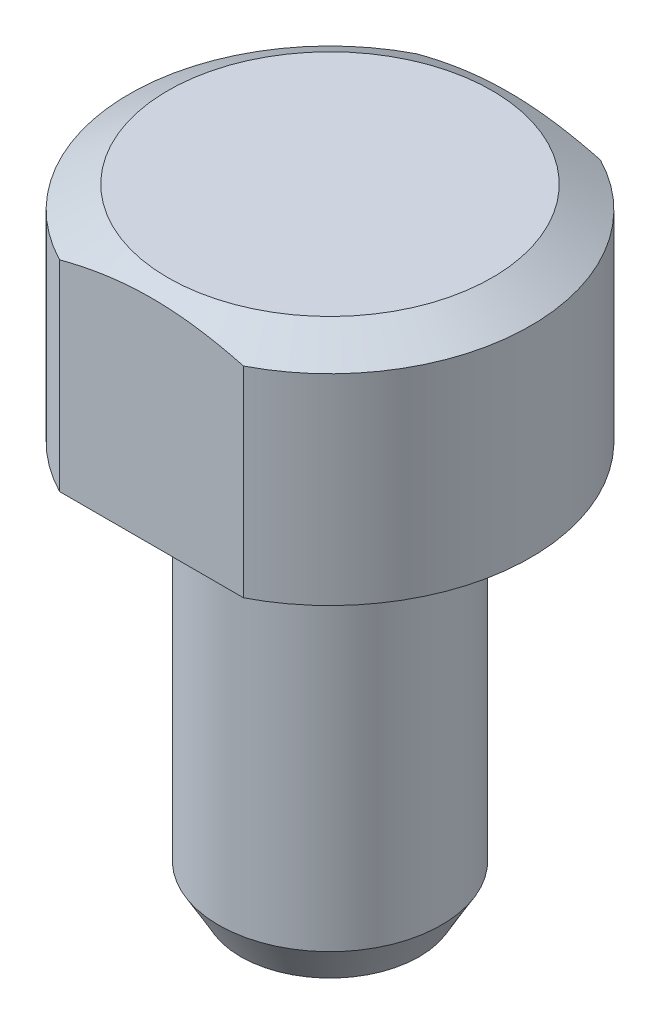
ISO-10303-21;
HEADER;
FILE_DESCRIPTION(('STEP AP214'),'2;1');
FILE_NAME('part.step','',(''),(''),'','','');
FILE_SCHEMA(('AUTOMOTIVE_DESIGN { 1 0 10303 214 1 1 1 1 }'));
ENDSEC;
DATA;
#1=APPLICATION_CONTEXT('core data for automotive mechanical design processes');
#2=APPLICATION_PROTOCOL_DEFINITION('international standard','automotive_design',2000,#1);
#3=PRODUCT_CONTEXT('',#1,'mechanical');
#4=PRODUCT('Part','Part','',(#3));
#5=PRODUCT_RELATED_PRODUCT_CATEGORY('part','',(#4));
#6=PRODUCT_DEFINITION_FORMATION('','',#4);
#7=PRODUCT_DEFINITION_CONTEXT('part definition',#1,'design');
#8=PRODUCT_DEFINITION('design','',#6,#7);
#9=PRODUCT_DEFINITION_SHAPE('','',#8);
#10=(LENGTH_UNIT() NAMED_UNIT(*) SI_UNIT(.MILLI.,.METRE.));
#11=(NAMED_UNIT(*) PLANE_ANGLE_UNIT() SI_UNIT($,.RADIAN.));
#12=(NAMED_UNIT(*) SI_UNIT($,.STERADIAN.) SOLID_ANGLE_UNIT());
#13=UNCERTAINTY_MEASURE_WITH_UNIT(LENGTH_MEASURE(1.E-05),#10,'distance_accuracy_value','');
#14=(GEOMETRIC_REPRESENTATION_CONTEXT(3) GLOBAL_UNCERTAINTY_ASSIGNED_CONTEXT((#13)) GLOBAL_UNIT_ASSIGNED_CONTEXT((#10,
#11,#12)) REPRESENTATION_CONTEXT('',''));
#15=CARTESIAN_POINT('',(0.,0.,0.));
#16=DIRECTION('',(0.,0.,1.));
#17=DIRECTION('',(1.,0.,0.));
#18=AXIS2_PLACEMENT_3D('',#15,#16,#17);
#19=CARTESIAN_POINT('',(0.,28.,0.));
#20=DIRECTION('',(0.,-1.,0.));
#21=DIRECTION('',(0.,0.,-1.));
#22=AXIS2_PLACEMENT_3D('',#19,#20,#21);
#23=CYLINDRICAL_SURFACE('',#22,9.);
#24=CARTESIAN_POINT('',(0.,27.,0.));
#25=DIRECTION('',(0.,1.,0.));
#26=DIRECTION('',(0.,0.,1.));
#27=AXIS2_PLACEMENT_3D('',#24,#25,#26);
#28=CIRCLE('',#27,9.);
#29=CARTESIAN_POINT('',(4.12310562561766,27.,-8.));
#30=VERTEX_POINT('',#29);
#31=CARTESIAN_POINT('',(4.12310562561766,27.,8.));
#32=VERTEX_POINT('',#31);
#33=EDGE_CURVE('E74',#30,#32,#28,.F.);
#34=ORIENTED_EDGE('',*,*,#33,.T.);
#35=DIRECTION('',(0.,-1.,0.));
#36=VECTOR('',#35,1.);
#37=CARTESIAN_POINT('',(4.12310562561767,28.,8.));
#38=LINE('',#37,#36);
#39=CARTESIAN_POINT('',(4.12310562561767,18.,8.));
#40=VERTEX_POINT('',#39);
#41=EDGE_CURVE('E36',#32,#40,#38,.T.);
#42=ORIENTED_EDGE('',*,*,#41,.T.);
#43=CARTESIAN_POINT('',(0.,18.,0.));
#44=DIRECTION('',(0.,1.,0.));
#45=DIRECTION('',(0.,0.,1.));
#46=AXIS2_PLACEMENT_3D('',#43,#44,#45);
#47=CIRCLE('',#46,9.);
#48=CARTESIAN_POINT('',(4.12310562561767,18.,-8.));
#49=VERTEX_POINT('',#48);
#50=EDGE_CURVE('E128',#40,#49,#47,.T.);
#51=ORIENTED_EDGE('',*,*,#50,.T.);
#52=DIRECTION('',(0.,-1.,0.));
#53=VECTOR('',#52,1.);
#54=CARTESIAN_POINT('',(4.12310562561767,28.,-8.));
#55=LINE('',#54,#53);
#56=EDGE_CURVE('E127',#49,#30,#55,.F.);
#57=ORIENTED_EDGE('',*,*,#56,.T.);
#58=EDGE_LOOP('',(#34,#42,#51,#57));
#59=FACE_BOUND('',#58,.T.);
#60=ADVANCED_FACE('F17',(#59),#23,.T.);
#61=CARTESIAN_POINT('',(0.,18.,0.));
#62=DIRECTION('',(0.,-1.,0.));
#63=DIRECTION('',(0.,0.,-1.));
#64=AXIS2_PLACEMENT_3D('',#61,#62,#63);
#65=CYLINDRICAL_SURFACE('',#64,5.);
#66=CARTESIAN_POINT('',(0.,1.73205080756888,0.));
#67=DIRECTION('',(0.,1.,0.));
#68=DIRECTION('',(0.,0.,1.));
#69=AXIS2_PLACEMENT_3D('',#66,#67,#68);
#70=CIRCLE('',#69,5.);
#71=CARTESIAN_POINT('',(0.,1.73205080756888,5.));
#72=VERTEX_POINT('',#71);
#73=EDGE_CURVE('E143',#72,#72,#70,.T.);
#74=ORIENTED_EDGE('',*,*,#73,.T.);
#75=EDGE_LOOP('',(#74));
#76=FACE_BOUND('',#75,.T.);
#77=CARTESIAN_POINT('',(0.,18.,0.));
#78=DIRECTION('',(0.,1.,0.));
#79=DIRECTION('',(0.,0.,1.));
#80=AXIS2_PLACEMENT_3D('',#77,#78,#79);
#81=CIRCLE('',#80,5.);
#82=CARTESIAN_POINT('',(0.,18.,5.));
#83=VERTEX_POINT('',#82);
#84=EDGE_CURVE('E140',#83,#83,#81,.T.);
#85=ORIENTED_EDGE('',*,*,#84,.F.);
#86=EDGE_LOOP('',(#85));
#87=FACE_BOUND('',#86,.T.);
#88=ADVANCED_FACE('F105',(#76,#87),#65,.T.);
#89=CARTESIAN_POINT('',(0.,0.,0.));
#90=DIRECTION('',(0.,1.,0.));
#91=DIRECTION('',(0.,0.,1.));
#92=AXIS2_PLACEMENT_3D('',#89,#90,#91);
#93=PLANE('',#92);
#94=CARTESIAN_POINT('',(0.,0.,0.));
#95=DIRECTION('',(0.,1.,0.));
#96=DIRECTION('',(0.,0.,1.));
#97=AXIS2_PLACEMENT_3D('',#94,#95,#96);
#98=CIRCLE('',#97,4.);
#99=CARTESIAN_POINT('',(0.,0.,4.));
#100=VERTEX_POINT('',#99);
#101=EDGE_CURVE('E78',#100,#100,#98,.F.);
#102=ORIENTED_EDGE('',*,*,#101,.T.);
#103=EDGE_LOOP('',(#102));
#104=FACE_BOUND('',#103,.T.);
#105=ADVANCED_FACE('F99',(#104),#93,.F.);
#106=CARTESIAN_POINT('',(0.,18.,0.));
#107=DIRECTION('',(0.,1.,0.));
#108=DIRECTION('',(0.,0.,1.));
#109=AXIS2_PLACEMENT_3D('',#106,#107,#108);
#110=PLANE('',#109);
#111=ORIENTED_EDGE('',*,*,#50,.F.);
#112=DIRECTION('',(-1.,0.,0.));
#113=VECTOR('',#112,1.);
#114=CARTESIAN_POINT('',(0.,18.,8.));
#115=LINE('',#114,#113);
#116=CARTESIAN_POINT('',(-4.12310562561767,18.,8.));
#117=VERTEX_POINT('',#116);
#118=EDGE_CURVE('E131',#40,#117,#115,.T.);
#119=ORIENTED_EDGE('',*,*,#118,.T.);
#120=CARTESIAN_POINT('',(-4.12310562561767,18.,-8.));
#121=VERTEX_POINT('',#120);
#122=EDGE_CURVE('E70',#121,#117,#47,.T.);
#123=ORIENTED_EDGE('',*,*,#122,.F.);
#124=DIRECTION('',(1.,0.,0.));
#125=VECTOR('',#124,1.);
#126=CARTESIAN_POINT('',(0.,18.,-8.));
#127=LINE('',#126,#125);
#128=EDGE_CURVE('E133',#121,#49,#127,.T.);
#129=ORIENTED_EDGE('',*,*,#128,.T.);
#130=EDGE_LOOP('',(#111,#119,#123,#129));
#131=FACE_BOUND('',#130,.T.);
#132=ORIENTED_EDGE('',*,*,#84,.T.);
#133=EDGE_LOOP('',(#132));
#134=FACE_BOUND('',#133,.T.);
#135=ADVANCED_FACE('F96',(#131,#134),#110,.F.);
#136=ORIENTED_EDGE('',*,*,#122,.T.);
#137=DIRECTION('',(0.,-1.,0.));
#138=VECTOR('',#137,1.);
#139=CARTESIAN_POINT('',(-4.12310562561767,28.,8.));
#140=LINE('',#139,#138);
#141=CARTESIAN_POINT('',(-4.12310562561789,27.,8.));
#142=VERTEX_POINT('',#141);
#143=EDGE_CURVE('E62',#117,#142,#140,.F.);
#144=ORIENTED_EDGE('',*,*,#143,.T.);
#145=CARTESIAN_POINT('',(-4.12310562561766,27.,-8.));
#146=VERTEX_POINT('',#145);
#147=EDGE_CURVE('E44',#142,#146,#28,.F.);
#148=ORIENTED_EDGE('',*,*,#147,.T.);
#149=DIRECTION('',(0.,-1.,0.));
#150=VECTOR('',#149,1.);
#151=CARTESIAN_POINT('',(-4.12310562561767,28.,-8.));
#152=LINE('',#151,#150);
#153=EDGE_CURVE('E130',#146,#121,#152,.T.);
#154=ORIENTED_EDGE('',*,*,#153,.T.);
#155=EDGE_LOOP('',(#136,#144,#148,#154));
#156=FACE_BOUND('',#155,.T.);
#157=ADVANCED_FACE('F68',(#156),#23,.T.);
#158=CARTESIAN_POINT('',(0.,28.,0.));
#159=DIRECTION('',(0.,1.,0.));
#160=DIRECTION('',(0.,0.,1.));
#161=AXIS2_PLACEMENT_3D('',#158,#159,#160);
#162=PLANE('',#161);
#163=CARTESIAN_POINT('',(0.,28.,0.));
#164=DIRECTION('',(0.,1.,0.));
#165=DIRECTION('',(0.,0.,1.));
#166=AXIS2_PLACEMENT_3D('',#163,#164,#165);
#167=CIRCLE('',#166,7.26794919243111);
#168=CARTESIAN_POINT('',(0.,28.,7.26794919243111));
#169=VERTEX_POINT('',#168);
#170=EDGE_CURVE('E75',#169,#169,#167,.T.);
#171=ORIENTED_EDGE('',*,*,#170,.T.);
#172=EDGE_LOOP('',(#171));
#173=FACE_BOUND('',#172,.T.);
#174=ADVANCED_FACE('F91',(#173),#162,.T.);
#175=CARTESIAN_POINT('',(0.,1.73205080756888,0.));
#176=DIRECTION('',(0.,1.,0.));
#177=DIRECTION('',(0.,0.,1.));
#178=AXIS2_PLACEMENT_3D('',#175,#176,#177);
#179=CONICAL_SURFACE('',#178,5.,0.523598775598299);
#180=ORIENTED_EDGE('',*,*,#101,.F.);
#181=EDGE_LOOP('',(#180));
#182=FACE_BOUND('',#181,.T.);
#183=ORIENTED_EDGE('',*,*,#73,.F.);
#184=EDGE_LOOP('',(#183));
#185=FACE_BOUND('',#184,.T.);
#186=ADVANCED_FACE('F94',(#182,#185),#179,.T.);
#187=CARTESIAN_POINT('',(0.,28.,0.));
#188=DIRECTION('',(0.,-1.,0.));
#189=DIRECTION('',(0.,0.,-1.));
#190=AXIS2_PLACEMENT_3D('',#187,#188,#189);
#191=CONICAL_SURFACE('',#190,7.26794919243111,1.0471975511966);
#192=CARTESIAN_POINT('',(-12.0671437710887,23.837205942196,8.));
#193=CARTESIAN_POINT('',(-11.7172802353373,24.0055120374331,8.));
#194=CARTESIAN_POINT('',(-11.3665685288091,24.1720880882037,8.));
#195=CARTESIAN_POINT('',(-10.6629891897649,24.500787028488,8.));
#196=CARTESIAN_POINT('',(-10.3101211761828,24.6629091013311,8.));
#197=CARTESIAN_POINT('',(-9.59977151222027,24.9826014406214,8.));
#198=CARTESIAN_POINT('',(-9.2422748826043,25.1401385484528,8.));
#199=CARTESIAN_POINT('',(-8.52427505227636,25.448177784122,8.));
#200=CARTESIAN_POINT('',(-8.16377201644156,25.5986802947998,8.));
#201=CARTESIAN_POINT('',(-7.43557474431023,25.8922084485543,8.));
#202=CARTESIAN_POINT('',(-7.06784465002481,26.0351456433883,8.));
#203=CARTESIAN_POINT('',(-6.32798370688172,26.3093624828742,8.));
#204=CARTESIAN_POINT('',(-5.95585236606487,26.440640810105,8.));
#205=CARTESIAN_POINT('',(-5.20741977937741,26.6878777509635,8.));
#206=CARTESIAN_POINT('',(-4.83112997275374,26.8038706045162,8.));
#207=CARTESIAN_POINT('',(-4.07322713486798,27.0166545819682,8.));
#208=CARTESIAN_POINT('',(-3.69161588150498,27.1134519620183,8.));
#209=CARTESIAN_POINT('',(-2.92267639967501,27.2830393802489,8.));
#210=CARTESIAN_POINT('',(-2.53534452730552,27.3558133603605,8.));
#211=CARTESIAN_POINT('',(-1.95109825095331,27.4432128287564,8.));
#212=CARTESIAN_POINT('',(-1.75578328179078,27.4687209091383,8.));
#213=CARTESIAN_POINT('',(-1.36430217834343,27.5119788079997,8.));
#214=CARTESIAN_POINT('',(-1.16813612559338,27.5297293537791,8.));
#215=CARTESIAN_POINT('',(-0.776355749011845,27.5570028343271,8.));
#216=CARTESIAN_POINT('',(-0.580744665154179,27.5665721439988,8.));
#217=CARTESIAN_POINT('',(-0.189293830045842,27.5774362946163,8.));
#218=CARTESIAN_POINT('',(0.00654591787700932,27.5787312545162,8.));
#219=CARTESIAN_POINT('',(0.398053471529314,27.5730162364685,8.));
#220=CARTESIAN_POINT('',(0.593721308755102,27.5660084212904,8.));
#221=CARTESIAN_POINT('',(0.984598793643017,27.5438561138194,8.));
#222=CARTESIAN_POINT('',(1.17980841455611,27.5287111578179,8.));
#223=CARTESIAN_POINT('',(1.65880788138693,27.4818731719563,8.));
#224=CARTESIAN_POINT('',(1.94217498507156,27.4457766755027,8.));
#225=CARTESIAN_POINT('',(2.506564243871,27.3584925577315,8.));
#226=CARTESIAN_POINT('',(2.7875860182128,27.3073025331166,8.));
#227=CARTESIAN_POINT('',(3.62768630889845,27.1336747624092,8.));
#228=CARTESIAN_POINT('',(4.18268579533908,26.9913017537429,8.));
#229=CARTESIAN_POINT('',(5.012503546365,26.7473954933085,8.));
#230=CARTESIAN_POINT('',(5.29169457622291,26.6599074259565,8.));
#231=CARTESIAN_POINT('',(5.84738018113453,26.4765991144525,8.));
#232=CARTESIAN_POINT('',(6.12387451892617,26.380778144375,8.));
#233=CARTESIAN_POINT('',(6.67278141716236,26.1828271004461,8.));
#234=CARTESIAN_POINT('',(6.94520828588905,26.0807363060795,8.));
#235=CARTESIAN_POINT('',(7.48777307590693,25.8708966563481,8.));
#236=CARTESIAN_POINT('',(7.75791173619208,25.7631497154217,8.));
#237=CARTESIAN_POINT('',(8.02709164198931,25.6531103109441,8.));
#238=B_SPLINE_CURVE_WITH_KNOTS('',3,(#192,#193,#194,#195,#196,#197,#198,#199,#200,#201,#202,
#203,#204,#205,#206,#207,#208,#209,#210,#211,#212,#213,#214,#215,#216,#217,#218,#219,#220,#221,
#222,#223,#224,#225,#226,#227,#228,#229,#230,#231,#232,#233,#234,#235,#236,#237),.UNSPECIFIED.,
.F.,.F.,(4,2,2,2,2,2,2,2,2,2,2,2,2,2,2,2,2,2,2,2,2,2,4),(0.,1.16474106297308,2.32969428366805,
3.50163926451872,4.67352039084203,5.85696687022688,7.04054690623785,8.2214289091817,
9.40192540654947,10.583209398172,11.1740001998336,11.7647356006074,12.3520998172825,
12.9394555898355,13.5266583971446,14.113894670743,14.9703746823237,15.8269911423649,
17.5435713760324,18.4212421435205,19.2989894465461,20.1717093621534,21.0441357688831),.UNSPECIFIED.);
#239=EDGE_CURVE('E11',#32,#142,#238,.F.);
#240=ORIENTED_EDGE('',*,*,#239,.F.);
#241=ORIENTED_EDGE('',*,*,#33,.F.);
#242=CARTESIAN_POINT('',(-12.0671437710887,23.837205942196,-8.));
#243=CARTESIAN_POINT('',(-11.7172802353373,24.0055120374331,-8.));
#244=CARTESIAN_POINT('',(-11.3665685288091,24.1720880882037,-8.));
#245=CARTESIAN_POINT('',(-10.6629891897649,24.500787028488,-8.));
#246=CARTESIAN_POINT('',(-10.3101211761828,24.6629091013311,-8.));
#247=CARTESIAN_POINT('',(-9.59977151222027,24.9826014406214,-8.));
#248=CARTESIAN_POINT('',(-9.2422748826043,25.1401385484528,-8.));
#249=CARTESIAN_POINT('',(-8.52427505227636,25.448177784122,-8.));
#250=CARTESIAN_POINT('',(-8.16377201644156,25.5986802947998,-8.));
#251=CARTESIAN_POINT('',(-7.43557474431023,25.8922084485543,-8.));
#252=CARTESIAN_POINT('',(-7.06784465002481,26.0351456433883,-8.));
#253=CARTESIAN_POINT('',(-6.32798370688172,26.3093624828742,-8.));
#254=CARTESIAN_POINT('',(-5.95585236606487,26.440640810105,-8.));
#255=CARTESIAN_POINT('',(-5.20741977937741,26.6878777509635,-8.));
#256=CARTESIAN_POINT('',(-4.83112997275374,26.8038706045162,-8.));
#257=CARTESIAN_POINT('',(-4.07322713486798,27.0166545819682,-8.));
#258=CARTESIAN_POINT('',(-3.69161588150498,27.1134519620183,-8.));
#259=CARTESIAN_POINT('',(-2.92267639967501,27.2830393802489,-8.));
#260=CARTESIAN_POINT('',(-2.53534452730552,27.3558133603605,-8.));
#261=CARTESIAN_POINT('',(-1.95109825095331,27.4432128287564,-8.));
#262=CARTESIAN_POINT('',(-1.75578328179078,27.4687209091383,-8.));
#263=CARTESIAN_POINT('',(-1.36430217834343,27.5119788079997,-8.));
#264=CARTESIAN_POINT('',(-1.16813612559338,27.5297293537791,-8.));
#265=CARTESIAN_POINT('',(-0.776355749011845,27.5570028343271,-8.));
#266=CARTESIAN_POINT('',(-0.580744665154179,27.5665721439988,-8.));
#267=CARTESIAN_POINT('',(-0.189293830045842,27.5774362946163,-8.));
#268=CARTESIAN_POINT('',(0.00654591787700932,27.5787312545162,-8.));
#269=CARTESIAN_POINT('',(0.398053471529314,27.5730162364685,-8.));
#270=CARTESIAN_POINT('',(0.593721308755102,27.5660084212904,-8.));
#271=CARTESIAN_POINT('',(0.984598793643017,27.5438561138194,-8.));
#272=CARTESIAN_POINT('',(1.17980841455611,27.5287111578179,-8.));
#273=CARTESIAN_POINT('',(1.65880788138693,27.4818731719563,-8.));
#274=CARTESIAN_POINT('',(1.94217498507156,27.4457766755027,-8.));
#275=CARTESIAN_POINT('',(2.506564243871,27.3584925577315,-8.));
#276=CARTESIAN_POINT('',(2.7875860182128,27.3073025331166,-8.));
#277=CARTESIAN_POINT('',(3.62768630889845,27.1336747624092,-8.));
#278=CARTESIAN_POINT('',(4.18268579533908,26.9913017537429,-8.));
#279=CARTESIAN_POINT('',(5.012503546365,26.7473954933085,-8.));
#280=CARTESIAN_POINT('',(5.29169457622291,26.6599074259565,-8.));
#281=CARTESIAN_POINT('',(5.84738018113453,26.4765991144525,-8.));
#282=CARTESIAN_POINT('',(6.12387451892617,26.380778144375,-8.));
#283=CARTESIAN_POINT('',(6.67278141716236,26.1828271004461,-8.));
#284=CARTESIAN_POINT('',(6.94520828588905,26.0807363060795,-8.));
#285=CARTESIAN_POINT('',(7.48777307590693,25.8708966563481,-8.));
#286=CARTESIAN_POINT('',(7.75791173619208,25.7631497154217,-8.));
#287=CARTESIAN_POINT('',(8.02709164198931,25.6531103109441,-8.));
#288=B_SPLINE_CURVE_WITH_KNOTS('',3,(#242,#243,#244,#245,#246,#247,#248,#249,#250,#251,#252,
#253,#254,#255,#256,#257,#258,#259,#260,#261,#262,#263,#264,#265,#266,#267,#268,#269,#270,#271,
#272,#273,#274,#275,#276,#277,#278,#279,#280,#281,#282,#283,#284,#285,#286,#287),.UNSPECIFIED.,
.F.,.F.,(4,2,2,2,2,2,2,2,2,2,2,2,2,2,2,2,2,2,2,2,2,2,4),(0.,1.16474106297308,2.32969428366805,
3.50163926451872,4.67352039084203,5.85696687022688,7.04054690623785,8.2214289091817,
9.40192540654947,10.583209398172,11.1740001998336,11.7647356006074,12.3520998172825,
12.9394555898355,13.5266583971446,14.113894670743,14.9703746823237,15.8269911423649,
17.5435713760324,18.4212421435205,19.2989894465461,20.1717093621534,21.0441357688831),.UNSPECIFIED.);
#289=EDGE_CURVE('E30',#146,#30,#288,.T.);
#290=ORIENTED_EDGE('',*,*,#289,.F.);
#291=ORIENTED_EDGE('',*,*,#147,.F.);
#292=EDGE_LOOP('',(#240,#241,#290,#291));
#293=FACE_BOUND('',#292,.T.);
#294=ORIENTED_EDGE('',*,*,#170,.F.);
#295=EDGE_LOOP('',(#294));
#296=FACE_BOUND('',#295,.T.);
#297=ADVANCED_FACE('F19',(#293,#296),#191,.T.);
#298=CARTESIAN_POINT('',(-13.6434385490772,0.,-8.));
#299=DIRECTION('',(0.,0.,1.));
#300=DIRECTION('',(1.,0.,0.));
#301=AXIS2_PLACEMENT_3D('',#298,#299,#300);
#302=PLANE('',#301);
#303=ORIENTED_EDGE('',*,*,#153,.F.);
#304=ORIENTED_EDGE('',*,*,#289,.T.);
#305=ORIENTED_EDGE('',*,*,#56,.F.);
#306=ORIENTED_EDGE('',*,*,#128,.F.);
#307=EDGE_LOOP('',(#303,#304,#305,#306));
#308=FACE_BOUND('',#307,.T.);
#309=ADVANCED_FACE('F85',(#308),#302,.F.);
#310=CARTESIAN_POINT('',(-14.1406937125971,0.,8.));
#311=DIRECTION('',(0.,0.,-1.));
#312=DIRECTION('',(-1.,0.,0.));
#313=AXIS2_PLACEMENT_3D('',#310,#311,#312);
#314=PLANE('',#313);
#315=ORIENTED_EDGE('',*,*,#41,.F.);
#316=ORIENTED_EDGE('',*,*,#239,.T.);
#317=ORIENTED_EDGE('',*,*,#143,.F.);
#318=ORIENTED_EDGE('',*,*,#118,.F.);
#319=EDGE_LOOP('',(#315,#316,#317,#318));
#320=FACE_BOUND('',#319,.T.);
#321=ADVANCED_FACE('F61',(#320),#314,.F.);
#322=CLOSED_SHELL('',(#60,#88,#105,#135,#157,#174,#186,#297,#309,#321));
#323=MANIFOLD_SOLID_BREP('B1',#322);
#324=ADVANCED_BREP_SHAPE_REPRESENTATION('',(#18,#323),#14);
#325=SHAPE_DEFINITION_REPRESENTATION(#9,#324);
ENDSEC;
END-ISO-10303-21;
